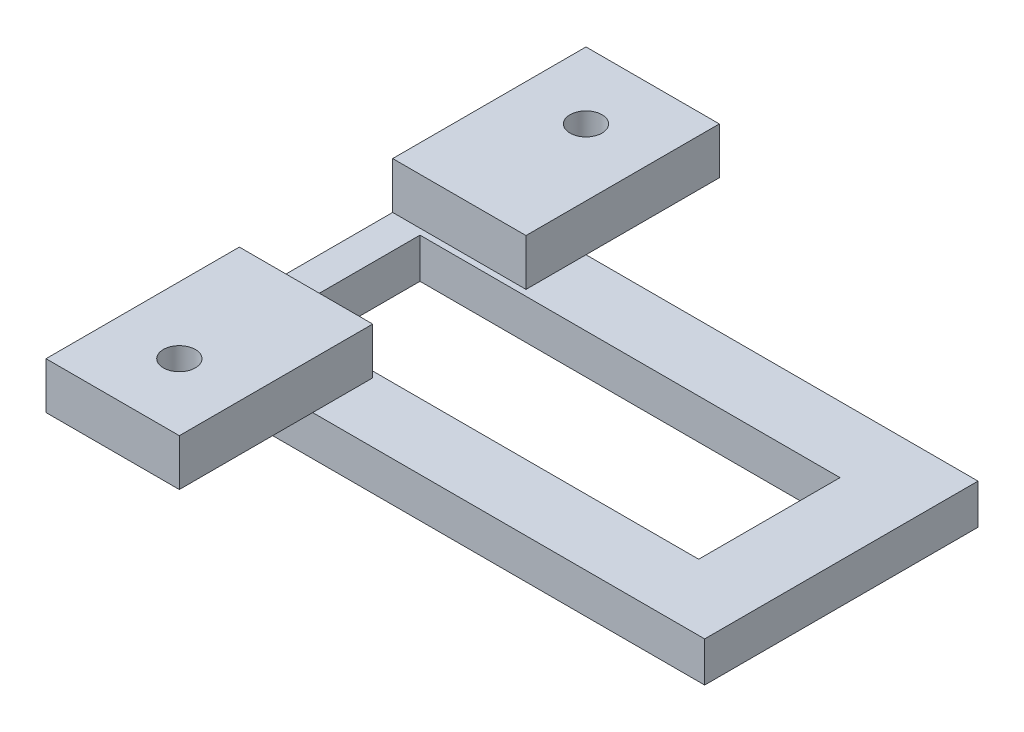
ISO-10303-21;
HEADER;
FILE_DESCRIPTION(('STEP AP214'),'2;1');
FILE_NAME('part.step','',(''),(''),'','','');
FILE_SCHEMA(('AUTOMOTIVE_DESIGN { 1 0 10303 214 1 1 1 1 }'));
ENDSEC;
DATA;
#1=APPLICATION_CONTEXT('core data for automotive mechanical design processes');
#2=APPLICATION_PROTOCOL_DEFINITION('international standard','automotive_design',2000,#1);
#3=PRODUCT_CONTEXT('',#1,'mechanical');
#4=PRODUCT('Part','Part','',(#3));
#5=PRODUCT_RELATED_PRODUCT_CATEGORY('part','',(#4));
#6=PRODUCT_DEFINITION_FORMATION('','',#4);
#7=PRODUCT_DEFINITION_CONTEXT('part definition',#1,'design');
#8=PRODUCT_DEFINITION('design','',#6,#7);
#9=PRODUCT_DEFINITION_SHAPE('','',#8);
#10=(LENGTH_UNIT() NAMED_UNIT(*) SI_UNIT(.MILLI.,.METRE.));
#11=(NAMED_UNIT(*) PLANE_ANGLE_UNIT() SI_UNIT($,.RADIAN.));
#12=(NAMED_UNIT(*) SI_UNIT($,.STERADIAN.) SOLID_ANGLE_UNIT());
#13=UNCERTAINTY_MEASURE_WITH_UNIT(LENGTH_MEASURE(1.E-05),#10,'distance_accuracy_value','');
#14=(GEOMETRIC_REPRESENTATION_CONTEXT(3) GLOBAL_UNCERTAINTY_ASSIGNED_CONTEXT((#13)) GLOBAL_UNIT_ASSIGNED_CONTEXT((#10,
#11,#12)) REPRESENTATION_CONTEXT('',''));
#15=CARTESIAN_POINT('',(0.,0.,0.));
#16=DIRECTION('',(0.,0.,1.));
#17=DIRECTION('',(1.,0.,0.));
#18=AXIS2_PLACEMENT_3D('',#15,#16,#17);
#19=CARTESIAN_POINT('',(-19.7,3.,-10.25));
#20=DIRECTION('',(0.,0.,1.));
#21=DIRECTION('',(1.,0.,0.));
#22=AXIS2_PLACEMENT_3D('',#19,#20,#21);
#23=PLANE('',#22);
#24=DIRECTION('',(-1.,0.,0.));
#25=VECTOR('',#24,1.);
#26=CARTESIAN_POINT('',(-19.7,3.,-10.25));
#27=LINE('',#26,#25);
#28=CARTESIAN_POINT('',(-9.7,3.,-10.25));
#29=VERTEX_POINT('',#28);
#30=CARTESIAN_POINT('',(-19.7,3.,-10.25));
#31=VERTEX_POINT('',#30);
#32=EDGE_CURVE('E224',#29,#31,#27,.T.);
#33=ORIENTED_EDGE('',*,*,#32,.F.);
#34=DIRECTION('',(-1.,0.,0.));
#35=VECTOR('',#34,1.);
#36=CARTESIAN_POINT('',(-19.7,3.,-10.25));
#37=LINE('',#36,#35);
#38=CARTESIAN_POINT('',(19.7,3.,-10.25));
#39=VERTEX_POINT('',#38);
#40=EDGE_CURVE('E350',#39,#29,#37,.T.);
#41=ORIENTED_EDGE('',*,*,#40,.F.);
#42=DIRECTION('',(0.,-1.,0.));
#43=VECTOR('',#42,1.);
#44=CARTESIAN_POINT('',(19.7,3.,-10.25));
#45=LINE('',#44,#43);
#46=CARTESIAN_POINT('',(19.7,0.,-10.25));
#47=VERTEX_POINT('',#46);
#48=EDGE_CURVE('E11',#39,#47,#45,.T.);
#49=ORIENTED_EDGE('',*,*,#48,.T.);
#50=DIRECTION('',(-1.,0.,0.));
#51=VECTOR('',#50,1.);
#52=CARTESIAN_POINT('',(-19.7,0.,-10.25));
#53=LINE('',#52,#51);
#54=CARTESIAN_POINT('',(-19.7,0.,-10.25));
#55=VERTEX_POINT('',#54);
#56=EDGE_CURVE('E364',#47,#55,#53,.T.);
#57=ORIENTED_EDGE('',*,*,#56,.T.);
#58=DIRECTION('',(0.,-1.,0.));
#59=VECTOR('',#58,1.);
#60=CARTESIAN_POINT('',(-19.7,3.,-10.25));
#61=LINE('',#60,#59);
#62=EDGE_CURVE('E54',#31,#55,#61,.T.);
#63=ORIENTED_EDGE('',*,*,#62,.F.);
#64=EDGE_LOOP('',(#33,#41,#49,#57,#63));
#65=FACE_BOUND('',#64,.T.);
#66=ADVANCED_FACE('F45',(#65),#23,.F.);
#67=CARTESIAN_POINT('',(-19.7,3.,10.25));
#68=DIRECTION('',(0.,0.,-1.));
#69=DIRECTION('',(-1.,0.,0.));
#70=AXIS2_PLACEMENT_3D('',#67,#68,#69);
#71=PLANE('',#70);
#72=DIRECTION('',(1.,0.,0.));
#73=VECTOR('',#72,1.);
#74=CARTESIAN_POINT('',(-19.7,3.,10.25));
#75=LINE('',#74,#73);
#76=CARTESIAN_POINT('',(-19.7,3.,10.25));
#77=VERTEX_POINT('',#76);
#78=CARTESIAN_POINT('',(-9.69999999999999,3.,10.25));
#79=VERTEX_POINT('',#78);
#80=EDGE_CURVE('E61',#77,#79,#75,.T.);
#81=ORIENTED_EDGE('',*,*,#80,.F.);
#82=DIRECTION('',(0.,-1.,0.));
#83=VECTOR('',#82,1.);
#84=CARTESIAN_POINT('',(-19.7,3.,10.25));
#85=LINE('',#84,#83);
#86=CARTESIAN_POINT('',(-19.7,0.,10.25));
#87=VERTEX_POINT('',#86);
#88=EDGE_CURVE('E377',#77,#87,#85,.T.);
#89=ORIENTED_EDGE('',*,*,#88,.T.);
#90=DIRECTION('',(1.,0.,0.));
#91=VECTOR('',#90,1.);
#92=CARTESIAN_POINT('',(-19.7,0.,10.25));
#93=LINE('',#92,#91);
#94=CARTESIAN_POINT('',(19.7,0.,10.25));
#95=VERTEX_POINT('',#94);
#96=EDGE_CURVE('E351',#87,#95,#93,.T.);
#97=ORIENTED_EDGE('',*,*,#96,.T.);
#98=DIRECTION('',(0.,-1.,0.));
#99=VECTOR('',#98,1.);
#100=CARTESIAN_POINT('',(19.7,3.,10.25));
#101=LINE('',#100,#99);
#102=CARTESIAN_POINT('',(19.7,3.,10.25));
#103=VERTEX_POINT('',#102);
#104=EDGE_CURVE('E360',#103,#95,#101,.T.);
#105=ORIENTED_EDGE('',*,*,#104,.F.);
#106=DIRECTION('',(1.,0.,0.));
#107=VECTOR('',#106,1.);
#108=CARTESIAN_POINT('',(-19.7,3.,10.25));
#109=LINE('',#108,#107);
#110=EDGE_CURVE('E357',#79,#103,#109,.T.);
#111=ORIENTED_EDGE('',*,*,#110,.F.);
#112=EDGE_LOOP('',(#81,#89,#97,#105,#111));
#113=FACE_BOUND('',#112,.T.);
#114=ADVANCED_FACE('F390',(#113),#71,.F.);
#115=CARTESIAN_POINT('',(19.7,3.,-10.25));
#116=DIRECTION('',(-1.,0.,0.));
#117=DIRECTION('',(0.,0.,1.));
#118=AXIS2_PLACEMENT_3D('',#115,#116,#117);
#119=PLANE('',#118);
#120=DIRECTION('',(0.,0.,-1.));
#121=VECTOR('',#120,1.);
#122=CARTESIAN_POINT('',(19.7,0.,-10.25));
#123=LINE('',#122,#121);
#124=EDGE_CURVE('E343',#95,#47,#123,.T.);
#125=ORIENTED_EDGE('',*,*,#124,.T.);
#126=ORIENTED_EDGE('',*,*,#48,.F.);
#127=DIRECTION('',(0.,0.,-1.));
#128=VECTOR('',#127,1.);
#129=CARTESIAN_POINT('',(19.7,3.,-10.25));
#130=LINE('',#129,#128);
#131=EDGE_CURVE('E346',#103,#39,#130,.T.);
#132=ORIENTED_EDGE('',*,*,#131,.F.);
#133=ORIENTED_EDGE('',*,*,#104,.T.);
#134=EDGE_LOOP('',(#125,#126,#132,#133));
#135=FACE_BOUND('',#134,.T.);
#136=ADVANCED_FACE('F47',(#135),#119,.F.);
#137=CARTESIAN_POINT('',(-19.7,3.,-10.25));
#138=DIRECTION('',(1.,0.,0.));
#139=DIRECTION('',(0.,0.,-1.));
#140=AXIS2_PLACEMENT_3D('',#137,#138,#139);
#141=PLANE('',#140);
#142=DIRECTION('',(0.,0.,1.));
#143=VECTOR('',#142,1.);
#144=CARTESIAN_POINT('',(-19.7,0.,-10.25));
#145=LINE('',#144,#143);
#146=EDGE_CURVE('E368',#55,#87,#145,.T.);
#147=ORIENTED_EDGE('',*,*,#146,.T.);
#148=ORIENTED_EDGE('',*,*,#88,.F.);
#149=DIRECTION('',(0.,0.,-1.));
#150=VECTOR('',#149,1.);
#151=CARTESIAN_POINT('',(-19.7,3.,20.25));
#152=LINE('',#151,#150);
#153=CARTESIAN_POINT('',(-19.7,3.,20.25));
#154=VERTEX_POINT('',#153);
#155=EDGE_CURVE('E271',#154,#77,#152,.T.);
#156=ORIENTED_EDGE('',*,*,#155,.F.);
#157=DIRECTION('',(0.,-1.,0.));
#158=VECTOR('',#157,1.);
#159=CARTESIAN_POINT('',(-19.7,6.5,20.25));
#160=LINE('',#159,#158);
#161=CARTESIAN_POINT('',(-19.7,6.5,20.25));
#162=VERTEX_POINT('',#161);
#163=EDGE_CURVE('E250',#162,#154,#160,.T.);
#164=ORIENTED_EDGE('',*,*,#163,.F.);
#165=DIRECTION('',(0.,0.,1.));
#166=VECTOR('',#165,1.);
#167=CARTESIAN_POINT('',(-19.7,6.5,10.25));
#168=LINE('',#167,#166);
#169=CARTESIAN_POINT('',(-19.7,6.5,5.75));
#170=VERTEX_POINT('',#169);
#171=EDGE_CURVE('E315',#170,#162,#168,.T.);
#172=ORIENTED_EDGE('',*,*,#171,.F.);
#173=DIRECTION('',(0.,-1.,0.));
#174=VECTOR('',#173,1.);
#175=CARTESIAN_POINT('',(-19.7,6.5,5.75));
#176=LINE('',#175,#174);
#177=CARTESIAN_POINT('',(-19.7,3.,5.75));
#178=VERTEX_POINT('',#177);
#179=EDGE_CURVE('E307',#170,#178,#176,.T.);
#180=ORIENTED_EDGE('',*,*,#179,.T.);
#181=DIRECTION('',(0.,0.,1.));
#182=VECTOR('',#181,1.);
#183=CARTESIAN_POINT('',(-19.7,3.,-10.25));
#184=LINE('',#183,#182);
#185=CARTESIAN_POINT('',(-19.7,3.,-5.75));
#186=VERTEX_POINT('',#185);
#187=EDGE_CURVE('E69',#186,#178,#184,.T.);
#188=ORIENTED_EDGE('',*,*,#187,.F.);
#189=DIRECTION('',(0.,-1.,0.));
#190=VECTOR('',#189,1.);
#191=CARTESIAN_POINT('',(-19.7,6.5,-5.75));
#192=LINE('',#191,#190);
#193=CARTESIAN_POINT('',(-19.7,6.5,-5.75));
#194=VERTEX_POINT('',#193);
#195=EDGE_CURVE('E299',#194,#186,#192,.T.);
#196=ORIENTED_EDGE('',*,*,#195,.F.);
#197=DIRECTION('',(0.,0.,1.));
#198=VECTOR('',#197,1.);
#199=CARTESIAN_POINT('',(-19.7,6.5,-10.25));
#200=LINE('',#199,#198);
#201=CARTESIAN_POINT('',(-19.7,6.5,-20.25));
#202=VERTEX_POINT('',#201);
#203=EDGE_CURVE('E276',#202,#194,#200,.T.);
#204=ORIENTED_EDGE('',*,*,#203,.F.);
#205=DIRECTION('',(0.,1.,0.));
#206=VECTOR('',#205,1.);
#207=CARTESIAN_POINT('',(-19.7,6.5,-20.25));
#208=LINE('',#207,#206);
#209=CARTESIAN_POINT('',(-19.7,3.,-20.25));
#210=VERTEX_POINT('',#209);
#211=EDGE_CURVE('E225',#210,#202,#208,.T.);
#212=ORIENTED_EDGE('',*,*,#211,.F.);
#213=DIRECTION('',(0.,0.,1.));
#214=VECTOR('',#213,1.);
#215=CARTESIAN_POINT('',(-19.7,3.,-20.25));
#216=LINE('',#215,#214);
#217=EDGE_CURVE('E239',#210,#31,#216,.T.);
#218=ORIENTED_EDGE('',*,*,#217,.T.);
#219=ORIENTED_EDGE('',*,*,#62,.T.);
#220=EDGE_LOOP('',(#147,#148,#156,#164,#172,#180,#188,#196,#204,#212,#218,#219));
#221=FACE_BOUND('',#220,.T.);
#222=ADVANCED_FACE('F381',(#221),#141,.F.);
#223=CARTESIAN_POINT('',(0.,3.,0.));
#224=DIRECTION('',(0.,1.,0.));
#225=DIRECTION('',(0.,0.,1.));
#226=AXIS2_PLACEMENT_3D('',#223,#224,#225);
#227=PLANE('',#226);
#228=DIRECTION('',(1.,0.,0.));
#229=VECTOR('',#228,1.);
#230=CARTESIAN_POINT('',(14.3,3.,5.3));
#231=LINE('',#230,#229);
#232=CARTESIAN_POINT('',(-17.2,3.,5.3));
#233=VERTEX_POINT('',#232);
#234=CARTESIAN_POINT('',(14.3,3.,5.3));
#235=VERTEX_POINT('',#234);
#236=EDGE_CURVE('E303',#233,#235,#231,.T.);
#237=ORIENTED_EDGE('',*,*,#236,.F.);
#238=DIRECTION('',(0.,0.,1.));
#239=VECTOR('',#238,1.);
#240=CARTESIAN_POINT('',(-17.2,3.,-5.3));
#241=LINE('',#240,#239);
#242=CARTESIAN_POINT('',(-17.2,3.,-5.3));
#243=VERTEX_POINT('',#242);
#244=EDGE_CURVE('E193',#243,#233,#241,.T.);
#245=ORIENTED_EDGE('',*,*,#244,.F.);
#246=DIRECTION('',(-1.,0.,0.));
#247=VECTOR('',#246,1.);
#248=CARTESIAN_POINT('',(14.3,3.,-5.3));
#249=LINE('',#248,#247);
#250=CARTESIAN_POINT('',(14.3,3.,-5.3));
#251=VERTEX_POINT('',#250);
#252=EDGE_CURVE('E182',#251,#243,#249,.T.);
#253=ORIENTED_EDGE('',*,*,#252,.F.);
#254=DIRECTION('',(0.,0.,-1.));
#255=VECTOR('',#254,1.);
#256=CARTESIAN_POINT('',(14.3,3.,-5.3));
#257=LINE('',#256,#255);
#258=EDGE_CURVE('E334',#235,#251,#257,.T.);
#259=ORIENTED_EDGE('',*,*,#258,.F.);
#260=EDGE_LOOP('',(#237,#245,#253,#259));
#261=FACE_BOUND('',#260,.T.);
#262=DIRECTION('',(0.,0.,-1.));
#263=VECTOR('',#262,1.);
#264=CARTESIAN_POINT('',(-9.7,3.,-10.25));
#265=LINE('',#264,#263);
#266=CARTESIAN_POINT('',(-9.7,3.,-5.75));
#267=VERTEX_POINT('',#266);
#268=EDGE_CURVE('E281',#267,#29,#265,.T.);
#269=ORIENTED_EDGE('',*,*,#268,.F.);
#270=DIRECTION('',(1.,0.,0.));
#271=VECTOR('',#270,1.);
#272=CARTESIAN_POINT('',(-19.7,3.,-5.75));
#273=LINE('',#272,#271);
#274=EDGE_CURVE('E288',#186,#267,#273,.T.);
#275=ORIENTED_EDGE('',*,*,#274,.F.);
#276=ORIENTED_EDGE('',*,*,#187,.T.);
#277=DIRECTION('',(-1.,0.,0.));
#278=VECTOR('',#277,1.);
#279=CARTESIAN_POINT('',(-19.7,3.,5.75));
#280=LINE('',#279,#278);
#281=CARTESIAN_POINT('',(-9.69999999999999,3.,5.75));
#282=VERTEX_POINT('',#281);
#283=EDGE_CURVE('E312',#282,#178,#280,.T.);
#284=ORIENTED_EDGE('',*,*,#283,.F.);
#285=DIRECTION('',(0.,0.,-1.));
#286=VECTOR('',#285,1.);
#287=CARTESIAN_POINT('',(-9.69999999999999,3.,10.25));
#288=LINE('',#287,#286);
#289=EDGE_CURVE('E292',#79,#282,#288,.T.);
#290=ORIENTED_EDGE('',*,*,#289,.F.);
#291=ORIENTED_EDGE('',*,*,#110,.T.);
#292=ORIENTED_EDGE('',*,*,#131,.T.);
#293=ORIENTED_EDGE('',*,*,#40,.T.);
#294=EDGE_LOOP('',(#269,#275,#276,#284,#290,#291,#292,#293));
#295=FACE_BOUND('',#294,.T.);
#296=ADVANCED_FACE('F393',(#261,#295),#227,.T.);
#297=CARTESIAN_POINT('',(0.,0.,0.));
#298=DIRECTION('',(0.,1.,0.));
#299=DIRECTION('',(0.,0.,1.));
#300=AXIS2_PLACEMENT_3D('',#297,#298,#299);
#301=PLANE('',#300);
#302=DIRECTION('',(0.,0.,1.));
#303=VECTOR('',#302,1.);
#304=CARTESIAN_POINT('',(-17.2,0.,-5.3));
#305=LINE('',#304,#303);
#306=CARTESIAN_POINT('',(-17.2,0.,-5.3));
#307=VERTEX_POINT('',#306);
#308=CARTESIAN_POINT('',(-17.2,0.,5.3));
#309=VERTEX_POINT('',#308);
#310=EDGE_CURVE('E172',#307,#309,#305,.T.);
#311=ORIENTED_EDGE('',*,*,#310,.T.);
#312=DIRECTION('',(1.,0.,0.));
#313=VECTOR('',#312,1.);
#314=CARTESIAN_POINT('',(14.3,0.,5.3));
#315=LINE('',#314,#313);
#316=CARTESIAN_POINT('',(14.3,0.,5.3));
#317=VERTEX_POINT('',#316);
#318=EDGE_CURVE('E326',#309,#317,#315,.T.);
#319=ORIENTED_EDGE('',*,*,#318,.T.);
#320=DIRECTION('',(0.,0.,-1.));
#321=VECTOR('',#320,1.);
#322=CARTESIAN_POINT('',(14.3,0.,-5.3));
#323=LINE('',#322,#321);
#324=CARTESIAN_POINT('',(14.3,0.,-5.3));
#325=VERTEX_POINT('',#324);
#326=EDGE_CURVE('E173',#317,#325,#323,.T.);
#327=ORIENTED_EDGE('',*,*,#326,.T.);
#328=DIRECTION('',(-1.,0.,0.));
#329=VECTOR('',#328,1.);
#330=CARTESIAN_POINT('',(14.3,0.,-5.3));
#331=LINE('',#330,#329);
#332=EDGE_CURVE('E166',#325,#307,#331,.T.);
#333=ORIENTED_EDGE('',*,*,#332,.T.);
#334=EDGE_LOOP('',(#311,#319,#327,#333));
#335=FACE_BOUND('',#334,.T.);
#336=ORIENTED_EDGE('',*,*,#124,.F.);
#337=ORIENTED_EDGE('',*,*,#96,.F.);
#338=ORIENTED_EDGE('',*,*,#146,.F.);
#339=ORIENTED_EDGE('',*,*,#56,.F.);
#340=EDGE_LOOP('',(#336,#337,#338,#339));
#341=FACE_BOUND('',#340,.T.);
#342=ADVANCED_FACE('F168',(#335,#341),#301,.F.);
#343=CARTESIAN_POINT('',(14.3,0.,-5.3));
#344=DIRECTION('',(0.,0.,-1.));
#345=DIRECTION('',(-1.,0.,0.));
#346=AXIS2_PLACEMENT_3D('',#343,#344,#345);
#347=PLANE('',#346);
#348=ORIENTED_EDGE('',*,*,#252,.T.);
#349=DIRECTION('',(0.,1.,0.));
#350=VECTOR('',#349,1.);
#351=CARTESIAN_POINT('',(-17.2,0.,-5.3));
#352=LINE('',#351,#350);
#353=EDGE_CURVE('E179',#307,#243,#352,.T.);
#354=ORIENTED_EDGE('',*,*,#353,.F.);
#355=ORIENTED_EDGE('',*,*,#332,.F.);
#356=DIRECTION('',(0.,1.,0.));
#357=VECTOR('',#356,1.);
#358=CARTESIAN_POINT('',(14.3,0.,-5.3));
#359=LINE('',#358,#357);
#360=EDGE_CURVE('E340',#325,#251,#359,.T.);
#361=ORIENTED_EDGE('',*,*,#360,.T.);
#362=EDGE_LOOP('',(#348,#354,#355,#361));
#363=FACE_BOUND('',#362,.T.);
#364=ADVANCED_FACE('F180',(#363),#347,.F.);
#365=CARTESIAN_POINT('',(14.3,0.,-5.3));
#366=DIRECTION('',(1.,0.,0.));
#367=DIRECTION('',(0.,0.,-1.));
#368=AXIS2_PLACEMENT_3D('',#365,#366,#367);
#369=PLANE('',#368);
#370=ORIENTED_EDGE('',*,*,#258,.T.);
#371=ORIENTED_EDGE('',*,*,#360,.F.);
#372=ORIENTED_EDGE('',*,*,#326,.F.);
#373=DIRECTION('',(0.,1.,0.));
#374=VECTOR('',#373,1.);
#375=CARTESIAN_POINT('',(14.3,0.,5.3));
#376=LINE('',#375,#374);
#377=EDGE_CURVE('E176',#317,#235,#376,.T.);
#378=ORIENTED_EDGE('',*,*,#377,.T.);
#379=EDGE_LOOP('',(#370,#371,#372,#378));
#380=FACE_BOUND('',#379,.T.);
#381=ADVANCED_FACE('F444',(#380),#369,.F.);
#382=CARTESIAN_POINT('',(14.3,0.,5.3));
#383=DIRECTION('',(0.,0.,1.));
#384=DIRECTION('',(1.,0.,0.));
#385=AXIS2_PLACEMENT_3D('',#382,#383,#384);
#386=PLANE('',#385);
#387=ORIENTED_EDGE('',*,*,#236,.T.);
#388=ORIENTED_EDGE('',*,*,#377,.F.);
#389=ORIENTED_EDGE('',*,*,#318,.F.);
#390=DIRECTION('',(0.,1.,0.));
#391=VECTOR('',#390,1.);
#392=CARTESIAN_POINT('',(-17.2,0.,5.3));
#393=LINE('',#392,#391);
#394=EDGE_CURVE('E187',#309,#233,#393,.T.);
#395=ORIENTED_EDGE('',*,*,#394,.T.);
#396=EDGE_LOOP('',(#387,#388,#389,#395));
#397=FACE_BOUND('',#396,.T.);
#398=ADVANCED_FACE('F426',(#397),#386,.F.);
#399=CARTESIAN_POINT('',(-9.69999999999999,6.5,10.25));
#400=DIRECTION('',(-1.,0.,0.));
#401=DIRECTION('',(0.,0.,1.));
#402=AXIS2_PLACEMENT_3D('',#399,#400,#401);
#403=PLANE('',#402);
#404=ORIENTED_EDGE('',*,*,#289,.T.);
#405=DIRECTION('',(0.,-1.,0.));
#406=VECTOR('',#405,1.);
#407=CARTESIAN_POINT('',(-9.69999999999999,6.5,5.75));
#408=LINE('',#407,#406);
#409=CARTESIAN_POINT('',(-9.69999999999999,6.5,5.75));
#410=VERTEX_POINT('',#409);
#411=EDGE_CURVE('E275',#410,#282,#408,.T.);
#412=ORIENTED_EDGE('',*,*,#411,.F.);
#413=DIRECTION('',(0.,0.,-1.));
#414=VECTOR('',#413,1.);
#415=CARTESIAN_POINT('',(-9.69999999999999,6.5,10.25));
#416=LINE('',#415,#414);
#417=CARTESIAN_POINT('',(-9.69999999999999,6.5,20.25));
#418=VERTEX_POINT('',#417);
#419=EDGE_CURVE('E321',#418,#410,#416,.T.);
#420=ORIENTED_EDGE('',*,*,#419,.F.);
#421=DIRECTION('',(0.,1.,0.));
#422=VECTOR('',#421,1.);
#423=CARTESIAN_POINT('',(-9.69999999999999,6.5,20.25));
#424=LINE('',#423,#422);
#425=CARTESIAN_POINT('',(-9.69999999999999,3.,20.25));
#426=VERTEX_POINT('',#425);
#427=EDGE_CURVE('E257',#426,#418,#424,.T.);
#428=ORIENTED_EDGE('',*,*,#427,.F.);
#429=DIRECTION('',(0.,0.,-1.));
#430=VECTOR('',#429,1.);
#431=CARTESIAN_POINT('',(-9.69999999999999,3.,20.25));
#432=LINE('',#431,#430);
#433=EDGE_CURVE('E265',#426,#79,#432,.T.);
#434=ORIENTED_EDGE('',*,*,#433,.T.);
#435=EDGE_LOOP('',(#404,#412,#420,#428,#434));
#436=FACE_BOUND('',#435,.T.);
#437=ADVANCED_FACE('F402',(#436),#403,.F.);
#438=CARTESIAN_POINT('',(-19.7,6.5,5.75));
#439=DIRECTION('',(0.,0.,1.));
#440=DIRECTION('',(1.,0.,0.));
#441=AXIS2_PLACEMENT_3D('',#438,#439,#440);
#442=PLANE('',#441);
#443=ORIENTED_EDGE('',*,*,#283,.T.);
#444=ORIENTED_EDGE('',*,*,#179,.F.);
#445=DIRECTION('',(-1.,0.,0.));
#446=VECTOR('',#445,1.);
#447=CARTESIAN_POINT('',(-19.7,6.5,5.75));
#448=LINE('',#447,#446);
#449=EDGE_CURVE('E311',#410,#170,#448,.T.);
#450=ORIENTED_EDGE('',*,*,#449,.F.);
#451=ORIENTED_EDGE('',*,*,#411,.T.);
#452=EDGE_LOOP('',(#443,#444,#450,#451));
#453=FACE_BOUND('',#452,.T.);
#454=ADVANCED_FACE('F414',(#453),#442,.F.);
#455=CARTESIAN_POINT('',(0.,6.5,0.));
#456=DIRECTION('',(0.,-1.,0.));
#457=DIRECTION('',(0.,0.,-1.));
#458=AXIS2_PLACEMENT_3D('',#455,#456,#457);
#459=PLANE('',#458);
#460=CARTESIAN_POINT('',(-14.7,6.5,15.25));
#461=DIRECTION('',(0.,-1.,0.));
#462=DIRECTION('',(0.,0.,-1.));
#463=AXIS2_PLACEMENT_3D('',#460,#461,#462);
#464=CIRCLE('',#463,1.2);
#465=CARTESIAN_POINT('',(-14.7,6.5,14.05));
#466=VERTEX_POINT('',#465);
#467=EDGE_CURVE('E208',#466,#466,#464,.T.);
#468=ORIENTED_EDGE('',*,*,#467,.T.);
#469=EDGE_LOOP('',(#468));
#470=FACE_BOUND('',#469,.T.);
#471=ORIENTED_EDGE('',*,*,#171,.T.);
#472=DIRECTION('',(-1.,0.,0.));
#473=VECTOR('',#472,1.);
#474=CARTESIAN_POINT('',(-19.7,6.5,20.25));
#475=LINE('',#474,#473);
#476=EDGE_CURVE('E261',#418,#162,#475,.T.);
#477=ORIENTED_EDGE('',*,*,#476,.F.);
#478=ORIENTED_EDGE('',*,*,#419,.T.);
#479=ORIENTED_EDGE('',*,*,#449,.T.);
#480=EDGE_LOOP('',(#471,#477,#478,#479));
#481=FACE_BOUND('',#480,.T.);
#482=ADVANCED_FACE('F408',(#470,#481),#459,.F.);
#483=CARTESIAN_POINT('',(-19.7,6.5,-5.75));
#484=DIRECTION('',(0.,0.,-1.));
#485=DIRECTION('',(-1.,0.,0.));
#486=AXIS2_PLACEMENT_3D('',#483,#484,#485);
#487=PLANE('',#486);
#488=ORIENTED_EDGE('',*,*,#274,.T.);
#489=DIRECTION('',(0.,-1.,0.));
#490=VECTOR('',#489,1.);
#491=CARTESIAN_POINT('',(-9.7,6.5,-5.75));
#492=LINE('',#491,#490);
#493=CARTESIAN_POINT('',(-9.7,6.5,-5.75));
#494=VERTEX_POINT('',#493);
#495=EDGE_CURVE('E287',#494,#267,#492,.T.);
#496=ORIENTED_EDGE('',*,*,#495,.F.);
#497=DIRECTION('',(1.,0.,0.));
#498=VECTOR('',#497,1.);
#499=CARTESIAN_POINT('',(-19.7,6.5,-5.75));
#500=LINE('',#499,#498);
#501=EDGE_CURVE('E280',#194,#494,#500,.T.);
#502=ORIENTED_EDGE('',*,*,#501,.F.);
#503=ORIENTED_EDGE('',*,*,#195,.T.);
#504=EDGE_LOOP('',(#488,#496,#502,#503));
#505=FACE_BOUND('',#504,.T.);
#506=ADVANCED_FACE('F422',(#505),#487,.F.);
#507=CARTESIAN_POINT('',(-9.7,6.5,-10.25));
#508=DIRECTION('',(-1.,0.,0.));
#509=DIRECTION('',(0.,0.,1.));
#510=AXIS2_PLACEMENT_3D('',#507,#508,#509);
#511=PLANE('',#510);
#512=ORIENTED_EDGE('',*,*,#268,.T.);
#513=DIRECTION('',(0.,0.,1.));
#514=VECTOR('',#513,1.);
#515=CARTESIAN_POINT('',(-9.7,3.,-20.25));
#516=LINE('',#515,#514);
#517=CARTESIAN_POINT('',(-9.7,3.,-20.25));
#518=VERTEX_POINT('',#517);
#519=EDGE_CURVE('E246',#518,#29,#516,.T.);
#520=ORIENTED_EDGE('',*,*,#519,.F.);
#521=DIRECTION('',(0.,-1.,0.));
#522=VECTOR('',#521,1.);
#523=CARTESIAN_POINT('',(-9.7,6.5,-20.25));
#524=LINE('',#523,#522);
#525=CARTESIAN_POINT('',(-9.7,6.5,-20.25));
#526=VERTEX_POINT('',#525);
#527=EDGE_CURVE('E233',#526,#518,#524,.T.);
#528=ORIENTED_EDGE('',*,*,#527,.F.);
#529=DIRECTION('',(0.,0.,-1.));
#530=VECTOR('',#529,1.);
#531=CARTESIAN_POINT('',(-9.7,6.5,-10.25));
#532=LINE('',#531,#530);
#533=EDGE_CURVE('E284',#494,#526,#532,.T.);
#534=ORIENTED_EDGE('',*,*,#533,.F.);
#535=ORIENTED_EDGE('',*,*,#495,.T.);
#536=EDGE_LOOP('',(#512,#520,#528,#534,#535));
#537=FACE_BOUND('',#536,.T.);
#538=ADVANCED_FACE('F559',(#537),#511,.F.);
#539=CARTESIAN_POINT('',(0.,6.5,0.));
#540=DIRECTION('',(0.,1.,0.));
#541=DIRECTION('',(0.,0.,1.));
#542=AXIS2_PLACEMENT_3D('',#539,#540,#541);
#543=PLANE('',#542);
#544=CARTESIAN_POINT('',(-14.7,6.5,-15.25));
#545=DIRECTION('',(0.,-1.,0.));
#546=DIRECTION('',(0.,0.,-1.));
#547=AXIS2_PLACEMENT_3D('',#544,#545,#546);
#548=CIRCLE('',#547,1.2);
#549=CARTESIAN_POINT('',(-14.7,6.5,-16.45));
#550=VERTEX_POINT('',#549);
#551=EDGE_CURVE('E220',#550,#550,#548,.T.);
#552=ORIENTED_EDGE('',*,*,#551,.T.);
#553=EDGE_LOOP('',(#552));
#554=FACE_BOUND('',#553,.T.);
#555=ORIENTED_EDGE('',*,*,#203,.T.);
#556=ORIENTED_EDGE('',*,*,#501,.T.);
#557=ORIENTED_EDGE('',*,*,#533,.T.);
#558=DIRECTION('',(1.,0.,0.));
#559=VECTOR('',#558,1.);
#560=CARTESIAN_POINT('',(-19.7,6.5,-20.25));
#561=LINE('',#560,#559);
#562=EDGE_CURVE('E229',#202,#526,#561,.T.);
#563=ORIENTED_EDGE('',*,*,#562,.F.);
#564=EDGE_LOOP('',(#555,#556,#557,#563));
#565=FACE_BOUND('',#564,.T.);
#566=ADVANCED_FACE('F541',(#554,#565),#543,.T.);
#567=CARTESIAN_POINT('',(-19.7,3.,20.25));
#568=DIRECTION('',(0.,1.,0.));
#569=DIRECTION('',(0.,0.,1.));
#570=AXIS2_PLACEMENT_3D('',#567,#568,#569);
#571=PLANE('',#570);
#572=CARTESIAN_POINT('',(-14.7,3.,15.25));
#573=DIRECTION('',(0.,-1.,0.));
#574=DIRECTION('',(0.,0.,-1.));
#575=AXIS2_PLACEMENT_3D('',#572,#573,#574);
#576=CIRCLE('',#575,2.2);
#577=CARTESIAN_POINT('',(-14.7,3.,13.05));
#578=VERTEX_POINT('',#577);
#579=EDGE_CURVE('E199',#578,#578,#576,.T.);
#580=ORIENTED_EDGE('',*,*,#579,.F.);
#581=EDGE_LOOP('',(#580));
#582=FACE_BOUND('',#581,.T.);
#583=ORIENTED_EDGE('',*,*,#80,.T.);
#584=ORIENTED_EDGE('',*,*,#433,.F.);
#585=DIRECTION('',(1.,0.,0.));
#586=VECTOR('',#585,1.);
#587=CARTESIAN_POINT('',(-19.7,3.,20.25));
#588=LINE('',#587,#586);
#589=EDGE_CURVE('E254',#154,#426,#588,.T.);
#590=ORIENTED_EDGE('',*,*,#589,.F.);
#591=ORIENTED_EDGE('',*,*,#155,.T.);
#592=EDGE_LOOP('',(#583,#584,#590,#591));
#593=FACE_BOUND('',#592,.T.);
#594=ADVANCED_FACE('F399',(#582,#593),#571,.F.);
#595=CARTESIAN_POINT('',(0.,0.,20.25));
#596=DIRECTION('',(0.,0.,1.));
#597=DIRECTION('',(1.,0.,0.));
#598=AXIS2_PLACEMENT_3D('',#595,#596,#597);
#599=PLANE('',#598);
#600=ORIENTED_EDGE('',*,*,#163,.T.);
#601=ORIENTED_EDGE('',*,*,#589,.T.);
#602=ORIENTED_EDGE('',*,*,#427,.T.);
#603=ORIENTED_EDGE('',*,*,#476,.T.);
#604=EDGE_LOOP('',(#600,#601,#602,#603));
#605=FACE_BOUND('',#604,.T.);
#606=ADVANCED_FACE('F405',(#605),#599,.T.);
#607=CARTESIAN_POINT('',(-19.7,3.,-20.25));
#608=DIRECTION('',(0.,1.,0.));
#609=DIRECTION('',(0.,0.,1.));
#610=AXIS2_PLACEMENT_3D('',#607,#608,#609);
#611=PLANE('',#610);
#612=CARTESIAN_POINT('',(-14.7,3.,-15.25));
#613=DIRECTION('',(0.,-1.,0.));
#614=DIRECTION('',(0.,0.,-1.));
#615=AXIS2_PLACEMENT_3D('',#612,#613,#614);
#616=CIRCLE('',#615,2.2);
#617=CARTESIAN_POINT('',(-14.7,3.,-17.45));
#618=VERTEX_POINT('',#617);
#619=EDGE_CURVE('E212',#618,#618,#616,.T.);
#620=ORIENTED_EDGE('',*,*,#619,.F.);
#621=EDGE_LOOP('',(#620));
#622=FACE_BOUND('',#621,.T.);
#623=ORIENTED_EDGE('',*,*,#32,.T.);
#624=ORIENTED_EDGE('',*,*,#217,.F.);
#625=DIRECTION('',(-1.,0.,0.));
#626=VECTOR('',#625,1.);
#627=CARTESIAN_POINT('',(-19.7,3.,-20.25));
#628=LINE('',#627,#626);
#629=EDGE_CURVE('E236',#518,#210,#628,.T.);
#630=ORIENTED_EDGE('',*,*,#629,.F.);
#631=ORIENTED_EDGE('',*,*,#519,.T.);
#632=EDGE_LOOP('',(#623,#624,#630,#631));
#633=FACE_BOUND('',#632,.T.);
#634=ADVANCED_FACE('F511',(#622,#633),#611,.F.);
#635=CARTESIAN_POINT('',(0.,0.,-20.25));
#636=DIRECTION('',(0.,0.,1.));
#637=DIRECTION('',(1.,0.,0.));
#638=AXIS2_PLACEMENT_3D('',#635,#636,#637);
#639=PLANE('',#638);
#640=ORIENTED_EDGE('',*,*,#211,.T.);
#641=ORIENTED_EDGE('',*,*,#562,.T.);
#642=ORIENTED_EDGE('',*,*,#527,.T.);
#643=ORIENTED_EDGE('',*,*,#629,.T.);
#644=EDGE_LOOP('',(#640,#641,#642,#643));
#645=FACE_BOUND('',#644,.T.);
#646=ADVANCED_FACE('F502',(#645),#639,.F.);
#647=CARTESIAN_POINT('',(-14.7,3.,-15.25));
#648=DIRECTION('',(0.,-1.,0.));
#649=DIRECTION('',(0.,0.,-1.));
#650=AXIS2_PLACEMENT_3D('',#647,#648,#649);
#651=CYLINDRICAL_SURFACE('',#650,1.2);
#652=ORIENTED_EDGE('',*,*,#551,.F.);
#653=EDGE_LOOP('',(#652));
#654=FACE_BOUND('',#653,.T.);
#655=CARTESIAN_POINT('',(-14.7,4.,-15.25));
#656=DIRECTION('',(0.,-1.,0.));
#657=DIRECTION('',(0.,0.,-1.));
#658=AXIS2_PLACEMENT_3D('',#655,#656,#657);
#659=CIRCLE('',#658,1.2);
#660=CARTESIAN_POINT('',(-14.7,4.,-16.45));
#661=VERTEX_POINT('',#660);
#662=EDGE_CURVE('E216',#661,#661,#659,.T.);
#663=ORIENTED_EDGE('',*,*,#662,.T.);
#664=EDGE_LOOP('',(#663));
#665=FACE_BOUND('',#664,.T.);
#666=ADVANCED_FACE('F493',(#654,#665),#651,.F.);
#667=CARTESIAN_POINT('',(-14.7,3.,-15.25));
#668=DIRECTION('',(0.,-1.,0.));
#669=DIRECTION('',(0.,0.,-1.));
#670=AXIS2_PLACEMENT_3D('',#667,#668,#669);
#671=CONICAL_SURFACE('',#670,2.2,0.785398163397448);
#672=ORIENTED_EDGE('',*,*,#662,.F.);
#673=EDGE_LOOP('',(#672));
#674=FACE_BOUND('',#673,.T.);
#675=ORIENTED_EDGE('',*,*,#619,.T.);
#676=EDGE_LOOP('',(#675));
#677=FACE_BOUND('',#676,.T.);
#678=ADVANCED_FACE('F484',(#674,#677),#671,.F.);
#679=CARTESIAN_POINT('',(-14.7,3.,15.25));
#680=DIRECTION('',(0.,-1.,0.));
#681=DIRECTION('',(0.,0.,-1.));
#682=AXIS2_PLACEMENT_3D('',#679,#680,#681);
#683=CYLINDRICAL_SURFACE('',#682,1.19999999999999);
#684=ORIENTED_EDGE('',*,*,#467,.F.);
#685=EDGE_LOOP('',(#684));
#686=FACE_BOUND('',#685,.T.);
#687=CARTESIAN_POINT('',(-14.7,4.,15.25));
#688=DIRECTION('',(0.,-1.,0.));
#689=DIRECTION('',(0.,0.,-1.));
#690=AXIS2_PLACEMENT_3D('',#687,#688,#689);
#691=CIRCLE('',#690,1.19999999999999);
#692=CARTESIAN_POINT('',(-14.7,4.,14.05));
#693=VERTEX_POINT('',#692);
#694=EDGE_CURVE('E204',#693,#693,#691,.T.);
#695=ORIENTED_EDGE('',*,*,#694,.T.);
#696=EDGE_LOOP('',(#695));
#697=FACE_BOUND('',#696,.T.);
#698=ADVANCED_FACE('F475',(#686,#697),#683,.F.);
#699=CARTESIAN_POINT('',(-14.7,3.,15.25));
#700=DIRECTION('',(0.,-1.,0.));
#701=DIRECTION('',(0.,0.,-1.));
#702=AXIS2_PLACEMENT_3D('',#699,#700,#701);
#703=CONICAL_SURFACE('',#702,2.2,0.785398163397453);
#704=ORIENTED_EDGE('',*,*,#694,.F.);
#705=EDGE_LOOP('',(#704));
#706=FACE_BOUND('',#705,.T.);
#707=ORIENTED_EDGE('',*,*,#579,.T.);
#708=EDGE_LOOP('',(#707));
#709=FACE_BOUND('',#708,.T.);
#710=ADVANCED_FACE('F465',(#706,#709),#703,.F.);
#711=CARTESIAN_POINT('',(-17.2,0.,-5.3));
#712=DIRECTION('',(-1.,0.,0.));
#713=DIRECTION('',(0.,0.,1.));
#714=AXIS2_PLACEMENT_3D('',#711,#712,#713);
#715=PLANE('',#714);
#716=ORIENTED_EDGE('',*,*,#244,.T.);
#717=ORIENTED_EDGE('',*,*,#394,.F.);
#718=ORIENTED_EDGE('',*,*,#310,.F.);
#719=ORIENTED_EDGE('',*,*,#353,.T.);
#720=EDGE_LOOP('',(#716,#717,#718,#719));
#721=FACE_BOUND('',#720,.T.);
#722=ADVANCED_FACE('F190',(#721),#715,.F.);
#723=CLOSED_SHELL('',(#66,#114,#136,#222,#296,#342,#364,#381,#398,#437,#454,#482,#506,#538,#566,
#594,#606,#634,#646,#666,#678,#698,#710,#722));
#724=MANIFOLD_SOLID_BREP('B2',#723);
#725=ADVANCED_BREP_SHAPE_REPRESENTATION('',(#18,#724),#14);
#726=SHAPE_DEFINITION_REPRESENTATION(#9,#725);
ENDSEC;
END-ISO-10303-21;
